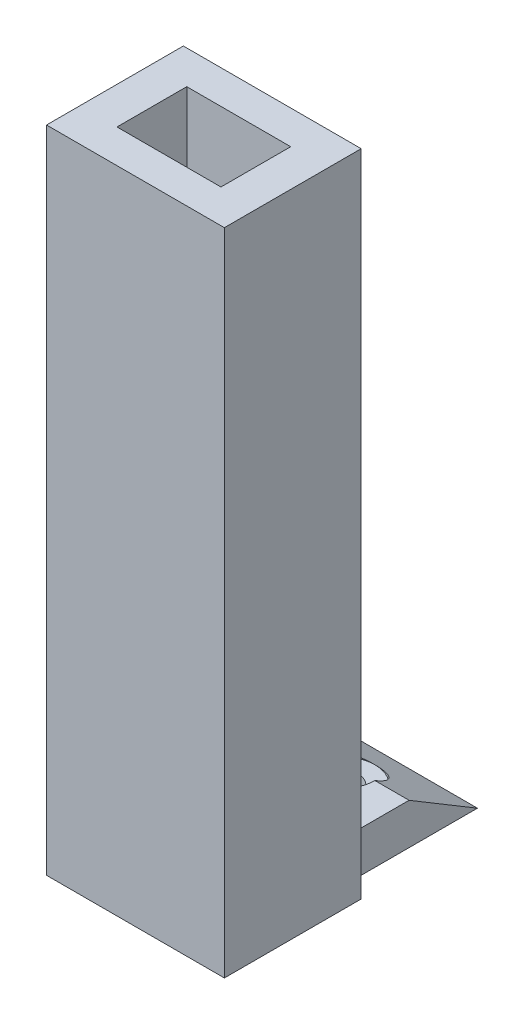
ISO-10303-21;
HEADER;
FILE_DESCRIPTION(('STEP AP214'),'2;1');
FILE_NAME('part.step','',(''),(''),'','','');
FILE_SCHEMA(('AUTOMOTIVE_DESIGN { 1 0 10303 214 1 1 1 1 }'));
ENDSEC;
DATA;
#1=APPLICATION_CONTEXT('core data for automotive mechanical design processes');
#2=APPLICATION_PROTOCOL_DEFINITION('international standard','automotive_design',2000,#1);
#3=PRODUCT_CONTEXT('',#1,'mechanical');
#4=PRODUCT('Part','Part','',(#3));
#5=PRODUCT_RELATED_PRODUCT_CATEGORY('part','',(#4));
#6=PRODUCT_DEFINITION_FORMATION('','',#4);
#7=PRODUCT_DEFINITION_CONTEXT('part definition',#1,'design');
#8=PRODUCT_DEFINITION('design','',#6,#7);
#9=PRODUCT_DEFINITION_SHAPE('','',#8);
#10=(LENGTH_UNIT() NAMED_UNIT(*) SI_UNIT(.MILLI.,.METRE.));
#11=(NAMED_UNIT(*) PLANE_ANGLE_UNIT() SI_UNIT($,.RADIAN.));
#12=(NAMED_UNIT(*) SI_UNIT($,.STERADIAN.) SOLID_ANGLE_UNIT());
#13=UNCERTAINTY_MEASURE_WITH_UNIT(LENGTH_MEASURE(1.E-05),#10,'distance_accuracy_value','');
#14=(GEOMETRIC_REPRESENTATION_CONTEXT(3) GLOBAL_UNCERTAINTY_ASSIGNED_CONTEXT((#13)) GLOBAL_UNIT_ASSIGNED_CONTEXT((#10,
#11,#12)) REPRESENTATION_CONTEXT('',''));
#15=CARTESIAN_POINT('',(0.,0.,0.));
#16=DIRECTION('',(0.,0.,1.));
#17=DIRECTION('',(1.,0.,0.));
#18=AXIS2_PLACEMENT_3D('',#15,#16,#17);
#19=CARTESIAN_POINT('',(-7.5,95.,5.));
#20=DIRECTION('',(0.,0.,-1.));
#21=DIRECTION('',(-1.,0.,0.));
#22=AXIS2_PLACEMENT_3D('',#19,#20,#21);
#23=PLANE('',#22);
#24=DIRECTION('',(0.,-1.,0.));
#25=VECTOR('',#24,1.);
#26=CARTESIAN_POINT('',(-6.5,50.,5.));
#27=LINE('',#26,#25);
#28=CARTESIAN_POINT('',(-6.5,50.,5.));
#29=VERTEX_POINT('',#28);
#30=CARTESIAN_POINT('',(-6.50000000000001,6.,5.));
#31=VERTEX_POINT('',#30);
#32=EDGE_CURVE('E273',#29,#31,#27,.T.);
#33=ORIENTED_EDGE('',*,*,#32,.F.);
#34=DIRECTION('',(1.,0.,0.));
#35=VECTOR('',#34,1.);
#36=CARTESIAN_POINT('',(0.,50.,5.));
#37=LINE('',#36,#35);
#38=CARTESIAN_POINT('',(6.5,50.,5.));
#39=VERTEX_POINT('',#38);
#40=EDGE_CURVE('E212',#29,#39,#37,.T.);
#41=ORIENTED_EDGE('',*,*,#40,.T.);
#42=DIRECTION('',(0.,1.,0.));
#43=VECTOR('',#42,1.);
#44=CARTESIAN_POINT('',(6.5,50.,5.));
#45=LINE('',#44,#43);
#46=CARTESIAN_POINT('',(6.5,6.,5.));
#47=VERTEX_POINT('',#46);
#48=EDGE_CURVE('E264',#47,#39,#45,.T.);
#49=ORIENTED_EDGE('',*,*,#48,.F.);
#50=DIRECTION('',(1.,0.,0.));
#51=VECTOR('',#50,1.);
#52=CARTESIAN_POINT('',(-7.5,6.,5.));
#53=LINE('',#52,#51);
#54=CARTESIAN_POINT('',(0.,6.,5.));
#55=VERTEX_POINT('',#54);
#56=EDGE_CURVE('E286',#55,#47,#53,.T.);
#57=ORIENTED_EDGE('',*,*,#56,.F.);
#58=EDGE_CURVE('E283',#31,#55,#53,.T.);
#59=ORIENTED_EDGE('',*,*,#58,.F.);
#60=EDGE_LOOP('',(#33,#41,#49,#57,#59));
#61=FACE_BOUND('',#60,.T.);
#62=ADVANCED_FACE('F59',(#61),#23,.T.);
#63=CARTESIAN_POINT('',(0.,6.,0.));
#64=DIRECTION('',(0.,1.,0.));
#65=DIRECTION('',(0.,0.,1.));
#66=AXIS2_PLACEMENT_3D('',#63,#64,#65);
#67=PLANE('',#66);
#68=DIRECTION('',(-1.,0.,0.));
#69=VECTOR('',#68,1.);
#70=CARTESIAN_POINT('',(-13.,6.,-10.));
#71=LINE('',#70,#69);
#72=CARTESIAN_POINT('',(10.,6.,-10.));
#73=VERTEX_POINT('',#72);
#74=CARTESIAN_POINT('',(6.5,6.,-10.));
#75=VERTEX_POINT('',#74);
#76=EDGE_CURVE('E258',#73,#75,#71,.T.);
#77=ORIENTED_EDGE('',*,*,#76,.F.);
#78=DIRECTION('',(0.,0.,1.));
#79=VECTOR('',#78,1.);
#80=CARTESIAN_POINT('',(10.,6.,-40.));
#81=LINE('',#80,#79);
#82=CARTESIAN_POINT('',(10.,6.,-20.));
#83=VERTEX_POINT('',#82);
#84=EDGE_CURVE('E227',#83,#73,#81,.T.);
#85=ORIENTED_EDGE('',*,*,#84,.F.);
#86=DIRECTION('',(-1.,0.,0.));
#87=VECTOR('',#86,1.);
#88=CARTESIAN_POINT('',(17.,6.,-20.));
#89=LINE('',#88,#87);
#90=CARTESIAN_POINT('',(5.00000000000001,6.,-20.));
#91=VERTEX_POINT('',#90);
#92=EDGE_CURVE('E246',#83,#91,#89,.T.);
#93=ORIENTED_EDGE('',*,*,#92,.T.);
#94=CARTESIAN_POINT('',(0.,6.,-20.));
#95=DIRECTION('',(0.,1.,0.));
#96=DIRECTION('',(0.,0.,1.));
#97=AXIS2_PLACEMENT_3D('',#94,#95,#96);
#98=CIRCLE('',#97,5.);
#99=CARTESIAN_POINT('',(-4.99999999999999,6.,-20.));
#100=VERTEX_POINT('',#99);
#101=EDGE_CURVE('E251',#100,#91,#98,.T.);
#102=ORIENTED_EDGE('',*,*,#101,.F.);
#103=CARTESIAN_POINT('',(-10.,6.,-20.));
#104=VERTEX_POINT('',#103);
#105=EDGE_CURVE('E232',#100,#104,#89,.T.);
#106=ORIENTED_EDGE('',*,*,#105,.T.);
#107=DIRECTION('',(0.,0.,1.));
#108=VECTOR('',#107,1.);
#109=CARTESIAN_POINT('',(-10.,6.,-40.));
#110=LINE('',#109,#108);
#111=CARTESIAN_POINT('',(-10.,6.,-10.));
#112=VERTEX_POINT('',#111);
#113=EDGE_CURVE('E224',#104,#112,#110,.T.);
#114=ORIENTED_EDGE('',*,*,#113,.T.);
#115=CARTESIAN_POINT('',(-6.50000000000001,6.,-10.));
#116=VERTEX_POINT('',#115);
#117=EDGE_CURVE('E261',#116,#112,#71,.T.);
#118=ORIENTED_EDGE('',*,*,#117,.F.);
#119=DIRECTION('',(0.,0.,-1.));
#120=VECTOR('',#119,1.);
#121=CARTESIAN_POINT('',(-6.50000000000001,6.,5.));
#122=LINE('',#121,#120);
#123=EDGE_CURVE('E277',#31,#116,#122,.T.);
#124=ORIENTED_EDGE('',*,*,#123,.F.);
#125=ORIENTED_EDGE('',*,*,#58,.T.);
#126=CARTESIAN_POINT('',(0.,6.,0.));
#127=DIRECTION('',(0.,1.,0.));
#128=DIRECTION('',(0.,0.,1.));
#129=AXIS2_PLACEMENT_3D('',#126,#127,#128);
#130=CIRCLE('',#129,5.);
#131=EDGE_CURVE('E298',#55,#55,#130,.T.);
#132=ORIENTED_EDGE('',*,*,#131,.F.);
#133=ORIENTED_EDGE('',*,*,#56,.T.);
#134=DIRECTION('',(0.,0.,-1.));
#135=VECTOR('',#134,1.);
#136=CARTESIAN_POINT('',(6.5,6.,5.));
#137=LINE('',#136,#135);
#138=EDGE_CURVE('E267',#47,#75,#137,.T.);
#139=ORIENTED_EDGE('',*,*,#138,.T.);
#140=EDGE_LOOP('',(#77,#85,#93,#102,#106,#114,#118,#124,#125,#132,#133,#139));
#141=FACE_BOUND('',#140,.T.);
#142=ADVANCED_FACE('F374',(#141),#67,.T.);
#143=CARTESIAN_POINT('',(13.,6.,-10.));
#144=DIRECTION('',(1.,0.,0.));
#145=DIRECTION('',(0.,0.,-1.));
#146=AXIS2_PLACEMENT_3D('',#143,#144,#145);
#147=PLANE('',#146);
#148=DIRECTION('',(0.,0.,1.));
#149=VECTOR('',#148,1.);
#150=CARTESIAN_POINT('',(13.,0.,-10.));
#151=LINE('',#150,#149);
#152=CARTESIAN_POINT('',(13.,0.,-10.));
#153=VERTEX_POINT('',#152);
#154=CARTESIAN_POINT('',(13.,0.,10.));
#155=VERTEX_POINT('',#154);
#156=EDGE_CURVE('E313',#153,#155,#151,.T.);
#157=ORIENTED_EDGE('',*,*,#156,.F.);
#158=DIRECTION('',(0.,-1.,0.));
#159=VECTOR('',#158,1.);
#160=CARTESIAN_POINT('',(13.,6.,-10.));
#161=LINE('',#160,#159);
#162=CARTESIAN_POINT('',(13.,95.,-10.));
#163=VERTEX_POINT('',#162);
#164=EDGE_CURVE('E315',#163,#153,#161,.T.);
#165=ORIENTED_EDGE('',*,*,#164,.F.);
#166=DIRECTION('',(0.,0.,1.));
#167=VECTOR('',#166,1.);
#168=CARTESIAN_POINT('',(13.,95.,-10.));
#169=LINE('',#168,#167);
#170=CARTESIAN_POINT('',(13.,95.,10.));
#171=VERTEX_POINT('',#170);
#172=EDGE_CURVE('E289',#163,#171,#169,.T.);
#173=ORIENTED_EDGE('',*,*,#172,.T.);
#174=DIRECTION('',(0.,-1.,0.));
#175=VECTOR('',#174,1.);
#176=CARTESIAN_POINT('',(13.,6.,10.));
#177=LINE('',#176,#175);
#178=EDGE_CURVE('E317',#171,#155,#177,.T.);
#179=ORIENTED_EDGE('',*,*,#178,.T.);
#180=EDGE_LOOP('',(#157,#165,#173,#179));
#181=FACE_BOUND('',#180,.T.);
#182=ADVANCED_FACE('F380',(#181),#147,.T.);
#183=CARTESIAN_POINT('',(0.,0.,0.));
#184=DIRECTION('',(0.,1.,0.));
#185=DIRECTION('',(0.,0.,1.));
#186=AXIS2_PLACEMENT_3D('',#183,#184,#185);
#187=PLANE('',#186);
#188=CARTESIAN_POINT('',(0.,0.,0.));
#189=DIRECTION('',(0.,1.,0.));
#190=DIRECTION('',(0.,0.,1.));
#191=AXIS2_PLACEMENT_3D('',#188,#189,#190);
#192=CIRCLE('',#191,2.6);
#193=CARTESIAN_POINT('',(0.,0.,2.6));
#194=VERTEX_POINT('',#193);
#195=EDGE_CURVE('E305',#194,#194,#192,.T.);
#196=ORIENTED_EDGE('',*,*,#195,.T.);
#197=EDGE_LOOP('',(#196));
#198=FACE_BOUND('',#197,.T.);
#199=CARTESIAN_POINT('',(0.,0.,-20.));
#200=DIRECTION('',(0.,-1.,0.));
#201=DIRECTION('',(0.,0.,-1.));
#202=AXIS2_PLACEMENT_3D('',#199,#200,#201);
#203=CIRCLE('',#202,2.6);
#204=CARTESIAN_POINT('',(0.,0.,-22.6));
#205=VERTEX_POINT('',#204);
#206=EDGE_CURVE('E254',#205,#205,#203,.T.);
#207=ORIENTED_EDGE('',*,*,#206,.F.);
#208=EDGE_LOOP('',(#207));
#209=FACE_BOUND('',#208,.T.);
#210=DIRECTION('',(0.,0.,1.));
#211=VECTOR('',#210,1.);
#212=CARTESIAN_POINT('',(10.,0.,-40.));
#213=LINE('',#212,#211);
#214=CARTESIAN_POINT('',(10.,0.,-30.));
#215=VERTEX_POINT('',#214);
#216=CARTESIAN_POINT('',(10.,0.,-10.));
#217=VERTEX_POINT('',#216);
#218=EDGE_CURVE('E229',#215,#217,#213,.T.);
#219=ORIENTED_EDGE('',*,*,#218,.T.);
#220=DIRECTION('',(-1.,0.,0.));
#221=VECTOR('',#220,1.);
#222=CARTESIAN_POINT('',(13.,0.,-10.));
#223=LINE('',#222,#221);
#224=EDGE_CURVE('E221',#153,#217,#223,.T.);
#225=ORIENTED_EDGE('',*,*,#224,.F.);
#226=ORIENTED_EDGE('',*,*,#156,.T.);
#227=DIRECTION('',(1.,0.,0.));
#228=VECTOR('',#227,1.);
#229=CARTESIAN_POINT('',(10.,0.,10.));
#230=LINE('',#229,#228);
#231=CARTESIAN_POINT('',(-13.,0.,10.));
#232=VERTEX_POINT('',#231);
#233=EDGE_CURVE('E310',#232,#155,#230,.T.);
#234=ORIENTED_EDGE('',*,*,#233,.F.);
#235=DIRECTION('',(0.,0.,1.));
#236=VECTOR('',#235,1.);
#237=CARTESIAN_POINT('',(-13.,0.,-10.));
#238=LINE('',#237,#236);
#239=CARTESIAN_POINT('',(-13.,0.,-10.));
#240=VERTEX_POINT('',#239);
#241=EDGE_CURVE('E308',#240,#232,#238,.T.);
#242=ORIENTED_EDGE('',*,*,#241,.F.);
#243=DIRECTION('',(-1.,0.,0.));
#244=VECTOR('',#243,1.);
#245=CARTESIAN_POINT('',(-13.,0.,-10.));
#246=LINE('',#245,#244);
#247=CARTESIAN_POINT('',(-10.,0.,-10.));
#248=VERTEX_POINT('',#247);
#249=EDGE_CURVE('E236',#248,#240,#246,.T.);
#250=ORIENTED_EDGE('',*,*,#249,.F.);
#251=DIRECTION('',(0.,0.,1.));
#252=VECTOR('',#251,1.);
#253=CARTESIAN_POINT('',(-10.,0.,-40.));
#254=LINE('',#253,#252);
#255=CARTESIAN_POINT('',(-10.,0.,-30.));
#256=VERTEX_POINT('',#255);
#257=EDGE_CURVE('E240',#256,#248,#254,.T.);
#258=ORIENTED_EDGE('',*,*,#257,.F.);
#259=DIRECTION('',(1.,0.,0.));
#260=VECTOR('',#259,1.);
#261=CARTESIAN_POINT('',(-13.,0.,-30.));
#262=LINE('',#261,#260);
#263=EDGE_CURVE('E257',#256,#215,#262,.T.);
#264=ORIENTED_EDGE('',*,*,#263,.T.);
#265=EDGE_LOOP('',(#219,#225,#226,#234,#242,#250,#258,#264));
#266=FACE_BOUND('',#265,.T.);
#267=ADVANCED_FACE('F404',(#198,#209,#266),#187,.F.);
#268=CARTESIAN_POINT('',(17.,6.,-20.));
#269=DIRECTION('',(0.,0.857492925712544,-0.514495755427526));
#270=DIRECTION('',(0.,0.514495755427527,0.857492925712544));
#271=AXIS2_PLACEMENT_3D('',#268,#269,#270);
#272=PLANE('',#271);
#273=ORIENTED_EDGE('',*,*,#92,.F.);
#274=DIRECTION('',(0.,-0.514495755427527,-0.857492925712544));
#275=VECTOR('',#274,1.);
#276=CARTESIAN_POINT('',(10.,6.,-20.));
#277=LINE('',#276,#275);
#278=EDGE_CURVE('E12',#83,#215,#277,.T.);
#279=ORIENTED_EDGE('',*,*,#278,.T.);
#280=ORIENTED_EDGE('',*,*,#263,.F.);
#281=DIRECTION('',(0.,0.514495755427527,0.857492925712544));
#282=VECTOR('',#281,1.);
#283=CARTESIAN_POINT('',(-10.,6.,-20.));
#284=LINE('',#283,#282);
#285=EDGE_CURVE('E67',#256,#104,#284,.T.);
#286=ORIENTED_EDGE('',*,*,#285,.T.);
#287=ORIENTED_EDGE('',*,*,#105,.F.);
#288=CARTESIAN_POINT('',(0.,6.,-20.));
#289=DIRECTION('',(0.,0.857492925712544,-0.514495755427526));
#290=DIRECTION('',(0.,0.514495755427527,0.857492925712544));
#291=AXIS2_PLACEMENT_3D('',#288,#289,#290);
#292=ELLIPSE('',#291,5.8309518948453,5.);
#293=CARTESIAN_POINT('',(0.,3.,-25.));
#294=VERTEX_POINT('',#293);
#295=EDGE_CURVE('E338',#100,#294,#292,.F.);
#296=ORIENTED_EDGE('',*,*,#295,.T.);
#297=EDGE_CURVE('E336',#294,#91,#292,.F.);
#298=ORIENTED_EDGE('',*,*,#297,.T.);
#299=EDGE_LOOP('',(#273,#279,#280,#286,#287,#296,#298));
#300=FACE_BOUND('',#299,.T.);
#301=ADVANCED_FACE('F345',(#300),#272,.T.);
#302=CARTESIAN_POINT('',(-13.,6.,-10.));
#303=DIRECTION('',(1.,0.,0.));
#304=DIRECTION('',(0.,0.,-1.));
#305=AXIS2_PLACEMENT_3D('',#302,#303,#304);
#306=PLANE('',#305);
#307=DIRECTION('',(0.,-1.,0.));
#308=VECTOR('',#307,1.);
#309=CARTESIAN_POINT('',(-13.,6.,-10.));
#310=LINE('',#309,#308);
#311=CARTESIAN_POINT('',(-13.,95.,-10.));
#312=VERTEX_POINT('',#311);
#313=EDGE_CURVE('E323',#312,#240,#310,.T.);
#314=ORIENTED_EDGE('',*,*,#313,.T.);
#315=ORIENTED_EDGE('',*,*,#241,.T.);
#316=DIRECTION('',(0.,-1.,0.));
#317=VECTOR('',#316,1.);
#318=CARTESIAN_POINT('',(-13.,6.,10.));
#319=LINE('',#318,#317);
#320=CARTESIAN_POINT('',(-13.,95.,10.));
#321=VERTEX_POINT('',#320);
#322=EDGE_CURVE('E320',#321,#232,#319,.T.);
#323=ORIENTED_EDGE('',*,*,#322,.F.);
#324=DIRECTION('',(0.,0.,1.));
#325=VECTOR('',#324,1.);
#326=CARTESIAN_POINT('',(-13.,95.,-10.));
#327=LINE('',#326,#325);
#328=EDGE_CURVE('E295',#312,#321,#327,.T.);
#329=ORIENTED_EDGE('',*,*,#328,.F.);
#330=EDGE_LOOP('',(#314,#315,#323,#329));
#331=FACE_BOUND('',#330,.T.);
#332=ADVANCED_FACE('F61',(#331),#306,.F.);
#333=CARTESIAN_POINT('',(0.,3.,-20.));
#334=DIRECTION('',(0.,1.,0.));
#335=DIRECTION('',(0.,0.,1.));
#336=AXIS2_PLACEMENT_3D('',#333,#334,#335);
#337=CYLINDRICAL_SURFACE('',#336,5.);
#338=ORIENTED_EDGE('',*,*,#295,.F.);
#339=ORIENTED_EDGE('',*,*,#101,.T.);
#340=ORIENTED_EDGE('',*,*,#297,.F.);
#341=CARTESIAN_POINT('',(0.,3.,-20.));
#342=DIRECTION('',(0.,1.,0.));
#343=DIRECTION('',(0.,0.,1.));
#344=AXIS2_PLACEMENT_3D('',#341,#342,#343);
#345=CIRCLE('',#344,5.);
#346=EDGE_CURVE('E247',#294,#294,#345,.T.);
#347=ORIENTED_EDGE('',*,*,#346,.F.);
#348=EDGE_LOOP('',(#338,#339,#340,#347));
#349=FACE_BOUND('',#348,.T.);
#350=ADVANCED_FACE('F349',(#349),#337,.F.);
#351=CARTESIAN_POINT('',(0.,6.,-20.));
#352=DIRECTION('',(0.,-1.,0.));
#353=DIRECTION('',(0.,0.,-1.));
#354=AXIS2_PLACEMENT_3D('',#351,#352,#353);
#355=CYLINDRICAL_SURFACE('',#354,2.6);
#356=ORIENTED_EDGE('',*,*,#206,.T.);
#357=EDGE_LOOP('',(#356));
#358=FACE_BOUND('',#357,.T.);
#359=CARTESIAN_POINT('',(0.,3.,-20.));
#360=DIRECTION('',(0.,1.,0.));
#361=DIRECTION('',(0.,0.,1.));
#362=AXIS2_PLACEMENT_3D('',#359,#360,#361);
#363=CIRCLE('',#362,2.6);
#364=CARTESIAN_POINT('',(0.,3.,-17.4));
#365=VERTEX_POINT('',#364);
#366=EDGE_CURVE('E250',#365,#365,#363,.F.);
#367=ORIENTED_EDGE('',*,*,#366,.F.);
#368=EDGE_LOOP('',(#367));
#369=FACE_BOUND('',#368,.T.);
#370=ADVANCED_FACE('F359',(#358,#369),#355,.F.);
#371=CARTESIAN_POINT('',(-10.,6.,-10.));
#372=DIRECTION('',(0.,0.,-1.));
#373=DIRECTION('',(-1.,0.,0.));
#374=AXIS2_PLACEMENT_3D('',#371,#372,#373);
#375=PLANE('',#374);
#376=ORIENTED_EDGE('',*,*,#164,.T.);
#377=ORIENTED_EDGE('',*,*,#224,.T.);
#378=DIRECTION('',(0.,1.,0.));
#379=VECTOR('',#378,1.);
#380=CARTESIAN_POINT('',(10.,6.,-10.));
#381=LINE('',#380,#379);
#382=EDGE_CURVE('E223',#217,#73,#381,.T.);
#383=ORIENTED_EDGE('',*,*,#382,.T.);
#384=ORIENTED_EDGE('',*,*,#76,.T.);
#385=DIRECTION('',(0.,1.,0.));
#386=VECTOR('',#385,1.);
#387=CARTESIAN_POINT('',(6.5,50.,-10.));
#388=LINE('',#387,#386);
#389=CARTESIAN_POINT('',(6.5,50.,-10.));
#390=VERTEX_POINT('',#389);
#391=EDGE_CURVE('E260',#75,#390,#388,.T.);
#392=ORIENTED_EDGE('',*,*,#391,.T.);
#393=DIRECTION('',(-1.,0.,0.));
#394=VECTOR('',#393,1.);
#395=CARTESIAN_POINT('',(0.,50.,-10.));
#396=LINE('',#395,#394);
#397=CARTESIAN_POINT('',(-6.5,50.,-10.));
#398=VERTEX_POINT('',#397);
#399=EDGE_CURVE('E280',#390,#398,#396,.T.);
#400=ORIENTED_EDGE('',*,*,#399,.T.);
#401=DIRECTION('',(0.,-1.,0.));
#402=VECTOR('',#401,1.);
#403=CARTESIAN_POINT('',(-6.5,50.,-10.));
#404=LINE('',#403,#402);
#405=EDGE_CURVE('E272',#398,#116,#404,.T.);
#406=ORIENTED_EDGE('',*,*,#405,.T.);
#407=ORIENTED_EDGE('',*,*,#117,.T.);
#408=DIRECTION('',(0.,-1.,0.));
#409=VECTOR('',#408,1.);
#410=CARTESIAN_POINT('',(-10.,6.,-10.));
#411=LINE('',#410,#409);
#412=EDGE_CURVE('E233',#112,#248,#411,.T.);
#413=ORIENTED_EDGE('',*,*,#412,.T.);
#414=ORIENTED_EDGE('',*,*,#249,.T.);
#415=ORIENTED_EDGE('',*,*,#313,.F.);
#416=DIRECTION('',(1.,0.,0.));
#417=VECTOR('',#416,1.);
#418=CARTESIAN_POINT('',(-13.,95.,-10.));
#419=LINE('',#418,#417);
#420=EDGE_CURVE('E292',#312,#163,#419,.T.);
#421=ORIENTED_EDGE('',*,*,#420,.T.);
#422=EDGE_LOOP('',(#376,#377,#383,#384,#392,#400,#406,#407,#413,#414,#415,#421));
#423=FACE_BOUND('',#422,.T.);
#424=ADVANCED_FACE('F361',(#423),#375,.T.);
#425=CARTESIAN_POINT('',(0.,0.,0.));
#426=DIRECTION('',(0.,1.,0.));
#427=DIRECTION('',(0.,0.,1.));
#428=AXIS2_PLACEMENT_3D('',#425,#426,#427);
#429=CYLINDRICAL_SURFACE('',#428,2.6);
#430=ORIENTED_EDGE('',*,*,#195,.F.);
#431=EDGE_LOOP('',(#430));
#432=FACE_BOUND('',#431,.T.);
#433=CARTESIAN_POINT('',(0.,3.,0.));
#434=DIRECTION('',(0.,1.,0.));
#435=DIRECTION('',(0.,0.,1.));
#436=AXIS2_PLACEMENT_3D('',#433,#434,#435);
#437=CIRCLE('',#436,2.6);
#438=CARTESIAN_POINT('',(0.,3.,2.6));
#439=VERTEX_POINT('',#438);
#440=EDGE_CURVE('E302',#439,#439,#437,.F.);
#441=ORIENTED_EDGE('',*,*,#440,.F.);
#442=EDGE_LOOP('',(#441));
#443=FACE_BOUND('',#442,.T.);
#444=ADVANCED_FACE('F368',(#432,#443),#429,.F.);
#445=CARTESIAN_POINT('',(10.,6.,10.));
#446=DIRECTION('',(0.,0.,-1.));
#447=DIRECTION('',(-1.,0.,0.));
#448=AXIS2_PLACEMENT_3D('',#445,#446,#447);
#449=PLANE('',#448);
#450=ORIENTED_EDGE('',*,*,#233,.T.);
#451=ORIENTED_EDGE('',*,*,#178,.F.);
#452=DIRECTION('',(1.,0.,0.));
#453=VECTOR('',#452,1.);
#454=CARTESIAN_POINT('',(-13.,95.,10.));
#455=LINE('',#454,#453);
#456=EDGE_CURVE('E285',#321,#171,#455,.T.);
#457=ORIENTED_EDGE('',*,*,#456,.F.);
#458=ORIENTED_EDGE('',*,*,#322,.T.);
#459=EDGE_LOOP('',(#450,#451,#457,#458));
#460=FACE_BOUND('',#459,.T.);
#461=ADVANCED_FACE('F396',(#460),#449,.F.);
#462=CARTESIAN_POINT('',(0.,3.,0.));
#463=DIRECTION('',(0.,1.,0.));
#464=DIRECTION('',(0.,0.,1.));
#465=AXIS2_PLACEMENT_3D('',#462,#463,#464);
#466=PLANE('',#465);
#467=CARTESIAN_POINT('',(0.,3.,0.));
#468=DIRECTION('',(0.,1.,0.));
#469=DIRECTION('',(0.,0.,1.));
#470=AXIS2_PLACEMENT_3D('',#467,#468,#469);
#471=CIRCLE('',#470,5.);
#472=CARTESIAN_POINT('',(0.,3.,5.));
#473=VERTEX_POINT('',#472);
#474=EDGE_CURVE('E299',#473,#473,#471,.T.);
#475=ORIENTED_EDGE('',*,*,#474,.T.);
#476=EDGE_LOOP('',(#475));
#477=FACE_BOUND('',#476,.T.);
#478=ORIENTED_EDGE('',*,*,#440,.T.);
#479=EDGE_LOOP('',(#478));
#480=FACE_BOUND('',#479,.T.);
#481=ADVANCED_FACE('F393',(#477,#480),#466,.T.);
#482=CARTESIAN_POINT('',(0.,3.,0.));
#483=DIRECTION('',(0.,1.,0.));
#484=DIRECTION('',(0.,0.,1.));
#485=AXIS2_PLACEMENT_3D('',#482,#483,#484);
#486=CYLINDRICAL_SURFACE('',#485,5.);
#487=ORIENTED_EDGE('',*,*,#474,.F.);
#488=EDGE_LOOP('',(#487));
#489=FACE_BOUND('',#488,.T.);
#490=ORIENTED_EDGE('',*,*,#131,.T.);
#491=EDGE_LOOP('',(#490));
#492=FACE_BOUND('',#491,.T.);
#493=ADVANCED_FACE('F391',(#489,#492),#486,.F.);
#494=CARTESIAN_POINT('',(0.,95.,0.));
#495=DIRECTION('',(0.,-1.,0.));
#496=DIRECTION('',(0.,0.,-1.));
#497=AXIS2_PLACEMENT_3D('',#494,#495,#496);
#498=PLANE('',#497);
#499=DIRECTION('',(0.,0.,-1.));
#500=VECTOR('',#499,1.);
#501=CARTESIAN_POINT('',(-7.6,95.,0.));
#502=LINE('',#501,#500);
#503=CARTESIAN_POINT('',(-7.6,95.,5.1));
#504=VERTEX_POINT('',#503);
#505=CARTESIAN_POINT('',(-7.6,95.,-5.1));
#506=VERTEX_POINT('',#505);
#507=EDGE_CURVE('E461',#504,#506,#502,.T.);
#508=ORIENTED_EDGE('',*,*,#507,.T.);
#509=DIRECTION('',(-1.,0.,0.));
#510=VECTOR('',#509,1.);
#511=CARTESIAN_POINT('',(0.,95.,-5.1));
#512=LINE('',#511,#510);
#513=CARTESIAN_POINT('',(7.6,95.,-5.1));
#514=VERTEX_POINT('',#513);
#515=EDGE_CURVE('E74',#514,#506,#512,.T.);
#516=ORIENTED_EDGE('',*,*,#515,.F.);
#517=DIRECTION('',(0.,0.,-1.));
#518=VECTOR('',#517,1.);
#519=CARTESIAN_POINT('',(7.6,95.,0.));
#520=LINE('',#519,#518);
#521=CARTESIAN_POINT('',(7.6,95.,5.1));
#522=VERTEX_POINT('',#521);
#523=EDGE_CURVE('E200',#522,#514,#520,.T.);
#524=ORIENTED_EDGE('',*,*,#523,.F.);
#525=DIRECTION('',(-1.,0.,0.));
#526=VECTOR('',#525,1.);
#527=CARTESIAN_POINT('',(0.,95.,5.1));
#528=LINE('',#527,#526);
#529=EDGE_CURVE('E459',#522,#504,#528,.T.);
#530=ORIENTED_EDGE('',*,*,#529,.T.);
#531=EDGE_LOOP('',(#508,#516,#524,#530));
#532=FACE_BOUND('',#531,.T.);
#533=ORIENTED_EDGE('',*,*,#456,.T.);
#534=ORIENTED_EDGE('',*,*,#172,.F.);
#535=ORIENTED_EDGE('',*,*,#420,.F.);
#536=ORIENTED_EDGE('',*,*,#328,.T.);
#537=EDGE_LOOP('',(#533,#534,#535,#536));
#538=FACE_BOUND('',#537,.T.);
#539=ADVANCED_FACE('F388',(#532,#538),#498,.F.);
#540=CARTESIAN_POINT('',(0.,50.,-5.));
#541=DIRECTION('',(0.,-1.,0.));
#542=DIRECTION('',(0.,0.,-1.));
#543=AXIS2_PLACEMENT_3D('',#540,#541,#542);
#544=PLANE('',#543);
#545=DIRECTION('',(-1.,0.,0.));
#546=VECTOR('',#545,1.);
#547=CARTESIAN_POINT('',(0.,50.,-5.1));
#548=LINE('',#547,#546);
#549=CARTESIAN_POINT('',(6.5,50.,-5.1));
#550=VERTEX_POINT('',#549);
#551=CARTESIAN_POINT('',(-6.5,50.,-5.1));
#552=VERTEX_POINT('',#551);
#553=EDGE_CURVE('E199',#550,#552,#548,.T.);
#554=ORIENTED_EDGE('',*,*,#553,.T.);
#555=DIRECTION('',(0.,0.,1.));
#556=VECTOR('',#555,1.);
#557=CARTESIAN_POINT('',(-6.5,50.,-5.));
#558=LINE('',#557,#556);
#559=EDGE_CURVE('E327',#398,#552,#558,.T.);
#560=ORIENTED_EDGE('',*,*,#559,.F.);
#561=ORIENTED_EDGE('',*,*,#399,.F.);
#562=DIRECTION('',(0.,0.,-1.));
#563=VECTOR('',#562,1.);
#564=CARTESIAN_POINT('',(6.5,50.,-5.));
#565=LINE('',#564,#563);
#566=EDGE_CURVE('E330',#550,#390,#565,.T.);
#567=ORIENTED_EDGE('',*,*,#566,.F.);
#568=EDGE_LOOP('',(#554,#560,#561,#567));
#569=FACE_BOUND('',#568,.T.);
#570=ADVANCED_FACE('F386',(#569),#544,.T.);
#571=CARTESIAN_POINT('',(-7.5,50.,5.));
#572=DIRECTION('',(0.,1.,0.));
#573=DIRECTION('',(0.,0.,1.));
#574=AXIS2_PLACEMENT_3D('',#571,#572,#573);
#575=PLANE('',#574);
#576=ORIENTED_EDGE('',*,*,#40,.F.);
#577=DIRECTION('',(0.,0.,-1.));
#578=VECTOR('',#577,1.);
#579=CARTESIAN_POINT('',(-6.5,50.,5.));
#580=LINE('',#579,#578);
#581=EDGE_CURVE('E197',#29,#552,#580,.T.);
#582=ORIENTED_EDGE('',*,*,#581,.T.);
#583=CARTESIAN_POINT('',(-7.6,50.,-5.1));
#584=VERTEX_POINT('',#583);
#585=EDGE_CURVE('E191',#552,#584,#548,.T.);
#586=ORIENTED_EDGE('',*,*,#585,.T.);
#587=DIRECTION('',(0.,0.,-1.));
#588=VECTOR('',#587,1.);
#589=CARTESIAN_POINT('',(-7.6,50.,0.));
#590=LINE('',#589,#588);
#591=CARTESIAN_POINT('',(-7.6,50.,5.1));
#592=VERTEX_POINT('',#591);
#593=EDGE_CURVE('E195',#592,#584,#590,.T.);
#594=ORIENTED_EDGE('',*,*,#593,.F.);
#595=DIRECTION('',(-1.,0.,0.));
#596=VECTOR('',#595,1.);
#597=CARTESIAN_POINT('',(0.,50.,5.1));
#598=LINE('',#597,#596);
#599=CARTESIAN_POINT('',(7.6,50.,5.1));
#600=VERTEX_POINT('',#599);
#601=EDGE_CURVE('E209',#600,#592,#598,.T.);
#602=ORIENTED_EDGE('',*,*,#601,.F.);
#603=DIRECTION('',(0.,0.,-1.));
#604=VECTOR('',#603,1.);
#605=CARTESIAN_POINT('',(7.6,50.,0.));
#606=LINE('',#605,#604);
#607=CARTESIAN_POINT('',(7.6,50.,-5.1));
#608=VERTEX_POINT('',#607);
#609=EDGE_CURVE('E217',#600,#608,#606,.T.);
#610=ORIENTED_EDGE('',*,*,#609,.T.);
#611=EDGE_CURVE('E82',#608,#550,#548,.T.);
#612=ORIENTED_EDGE('',*,*,#611,.T.);
#613=EDGE_CURVE('E331',#39,#550,#565,.T.);
#614=ORIENTED_EDGE('',*,*,#613,.F.);
#615=EDGE_LOOP('',(#576,#582,#586,#594,#602,#610,#612,#614));
#616=FACE_BOUND('',#615,.T.);
#617=ADVANCED_FACE('F193',(#616),#575,.T.);
#618=CARTESIAN_POINT('',(-6.5,50.,5.));
#619=DIRECTION('',(1.,0.,0.));
#620=DIRECTION('',(0.,1.,0.));
#621=AXIS2_PLACEMENT_3D('',#618,#619,#620);
#622=PLANE('',#621);
#623=ORIENTED_EDGE('',*,*,#405,.F.);
#624=ORIENTED_EDGE('',*,*,#559,.T.);
#625=ORIENTED_EDGE('',*,*,#581,.F.);
#626=ORIENTED_EDGE('',*,*,#32,.T.);
#627=ORIENTED_EDGE('',*,*,#123,.T.);
#628=EDGE_LOOP('',(#623,#624,#625,#626,#627));
#629=FACE_BOUND('',#628,.T.);
#630=ADVANCED_FACE('F474',(#629),#622,.T.);
#631=CARTESIAN_POINT('',(6.5,50.,5.));
#632=DIRECTION('',(-1.,0.,0.));
#633=DIRECTION('',(0.,-1.,0.));
#634=AXIS2_PLACEMENT_3D('',#631,#632,#633);
#635=PLANE('',#634);
#636=ORIENTED_EDGE('',*,*,#391,.F.);
#637=ORIENTED_EDGE('',*,*,#138,.F.);
#638=ORIENTED_EDGE('',*,*,#48,.T.);
#639=ORIENTED_EDGE('',*,*,#613,.T.);
#640=ORIENTED_EDGE('',*,*,#566,.T.);
#641=EDGE_LOOP('',(#636,#637,#638,#639,#640));
#642=FACE_BOUND('',#641,.T.);
#643=ADVANCED_FACE('F355',(#642),#635,.T.);
#644=CARTESIAN_POINT('',(0.,3.,-20.));
#645=DIRECTION('',(0.,1.,0.));
#646=DIRECTION('',(0.,0.,1.));
#647=AXIS2_PLACEMENT_3D('',#644,#645,#646);
#648=PLANE('',#647);
#649=ORIENTED_EDGE('',*,*,#346,.T.);
#650=EDGE_LOOP('',(#649));
#651=FACE_BOUND('',#650,.T.);
#652=ORIENTED_EDGE('',*,*,#366,.T.);
#653=EDGE_LOOP('',(#652));
#654=FACE_BOUND('',#653,.T.);
#655=ADVANCED_FACE('F351',(#651,#654),#648,.T.);
#656=CARTESIAN_POINT('',(-10.,6.,-40.));
#657=DIRECTION('',(-1.,0.,0.));
#658=DIRECTION('',(0.,0.,1.));
#659=AXIS2_PLACEMENT_3D('',#656,#657,#658);
#660=PLANE('',#659);
#661=ORIENTED_EDGE('',*,*,#257,.T.);
#662=ORIENTED_EDGE('',*,*,#412,.F.);
#663=ORIENTED_EDGE('',*,*,#113,.F.);
#664=ORIENTED_EDGE('',*,*,#285,.F.);
#665=EDGE_LOOP('',(#661,#662,#663,#664));
#666=FACE_BOUND('',#665,.T.);
#667=ADVANCED_FACE('F354',(#666),#660,.T.);
#668=CARTESIAN_POINT('',(10.,6.,-40.));
#669=DIRECTION('',(1.,0.,0.));
#670=DIRECTION('',(0.,0.,-1.));
#671=AXIS2_PLACEMENT_3D('',#668,#669,#670);
#672=PLANE('',#671);
#673=ORIENTED_EDGE('',*,*,#84,.T.);
#674=ORIENTED_EDGE('',*,*,#382,.F.);
#675=ORIENTED_EDGE('',*,*,#218,.F.);
#676=ORIENTED_EDGE('',*,*,#278,.F.);
#677=EDGE_LOOP('',(#673,#674,#675,#676));
#678=FACE_BOUND('',#677,.T.);
#679=ADVANCED_FACE('F436',(#678),#672,.T.);
#680=CARTESIAN_POINT('',(0.,50.,-5.1));
#681=DIRECTION('',(0.,0.,-1.));
#682=DIRECTION('',(-1.,0.,0.));
#683=AXIS2_PLACEMENT_3D('',#680,#681,#682);
#684=PLANE('',#683);
#685=ORIENTED_EDGE('',*,*,#515,.T.);
#686=DIRECTION('',(0.,1.,0.));
#687=VECTOR('',#686,1.);
#688=CARTESIAN_POINT('',(-7.6,50.,-5.1));
#689=LINE('',#688,#687);
#690=EDGE_CURVE('E206',#584,#506,#689,.T.);
#691=ORIENTED_EDGE('',*,*,#690,.F.);
#692=ORIENTED_EDGE('',*,*,#585,.F.);
#693=ORIENTED_EDGE('',*,*,#553,.F.);
#694=ORIENTED_EDGE('',*,*,#611,.F.);
#695=DIRECTION('',(0.,1.,0.));
#696=VECTOR('',#695,1.);
#697=CARTESIAN_POINT('',(7.6,50.,-5.1));
#698=LINE('',#697,#696);
#699=EDGE_CURVE('E237',#608,#514,#698,.T.);
#700=ORIENTED_EDGE('',*,*,#699,.T.);
#701=EDGE_LOOP('',(#685,#691,#692,#693,#694,#700));
#702=FACE_BOUND('',#701,.T.);
#703=ADVANCED_FACE('F211',(#702),#684,.F.);
#704=CARTESIAN_POINT('',(7.6,50.,0.));
#705=DIRECTION('',(1.,0.,0.));
#706=DIRECTION('',(0.,0.,-1.));
#707=AXIS2_PLACEMENT_3D('',#704,#705,#706);
#708=PLANE('',#707);
#709=ORIENTED_EDGE('',*,*,#523,.T.);
#710=ORIENTED_EDGE('',*,*,#699,.F.);
#711=ORIENTED_EDGE('',*,*,#609,.F.);
#712=DIRECTION('',(0.,1.,0.));
#713=VECTOR('',#712,1.);
#714=CARTESIAN_POINT('',(7.6,50.,5.1));
#715=LINE('',#714,#713);
#716=EDGE_CURVE('E214',#600,#522,#715,.T.);
#717=ORIENTED_EDGE('',*,*,#716,.T.);
#718=EDGE_LOOP('',(#709,#710,#711,#717));
#719=FACE_BOUND('',#718,.T.);
#720=ADVANCED_FACE('F443',(#719),#708,.F.);
#721=CARTESIAN_POINT('',(0.,50.,5.1));
#722=DIRECTION('',(0.,0.,-1.));
#723=DIRECTION('',(-1.,0.,0.));
#724=AXIS2_PLACEMENT_3D('',#721,#722,#723);
#725=PLANE('',#724);
#726=ORIENTED_EDGE('',*,*,#529,.F.);
#727=ORIENTED_EDGE('',*,*,#716,.F.);
#728=ORIENTED_EDGE('',*,*,#601,.T.);
#729=DIRECTION('',(0.,1.,0.));
#730=VECTOR('',#729,1.);
#731=CARTESIAN_POINT('',(-7.6,50.,5.1));
#732=LINE('',#731,#730);
#733=EDGE_CURVE('E208',#592,#504,#732,.T.);
#734=ORIENTED_EDGE('',*,*,#733,.T.);
#735=EDGE_LOOP('',(#726,#727,#728,#734));
#736=FACE_BOUND('',#735,.T.);
#737=ADVANCED_FACE('F446',(#736),#725,.T.);
#738=CARTESIAN_POINT('',(-7.6,50.,0.));
#739=DIRECTION('',(1.,0.,0.));
#740=DIRECTION('',(0.,0.,-1.));
#741=AXIS2_PLACEMENT_3D('',#738,#739,#740);
#742=PLANE('',#741);
#743=ORIENTED_EDGE('',*,*,#507,.F.);
#744=ORIENTED_EDGE('',*,*,#733,.F.);
#745=ORIENTED_EDGE('',*,*,#593,.T.);
#746=ORIENTED_EDGE('',*,*,#690,.T.);
#747=EDGE_LOOP('',(#743,#744,#745,#746));
#748=FACE_BOUND('',#747,.T.);
#749=ADVANCED_FACE('F205',(#748),#742,.T.);
#750=CLOSED_SHELL('',(#62,#142,#182,#267,#301,#332,#350,#370,#424,#444,#461,#481,#493,#539,#570,
#617,#630,#643,#655,#667,#679,#703,#720,#737,#749));
#751=MANIFOLD_SOLID_BREP('B2',#750);
#752=ADVANCED_BREP_SHAPE_REPRESENTATION('',(#18,#751),#14);
#753=SHAPE_DEFINITION_REPRESENTATION(#9,#752);
ENDSEC;
END-ISO-10303-21;
